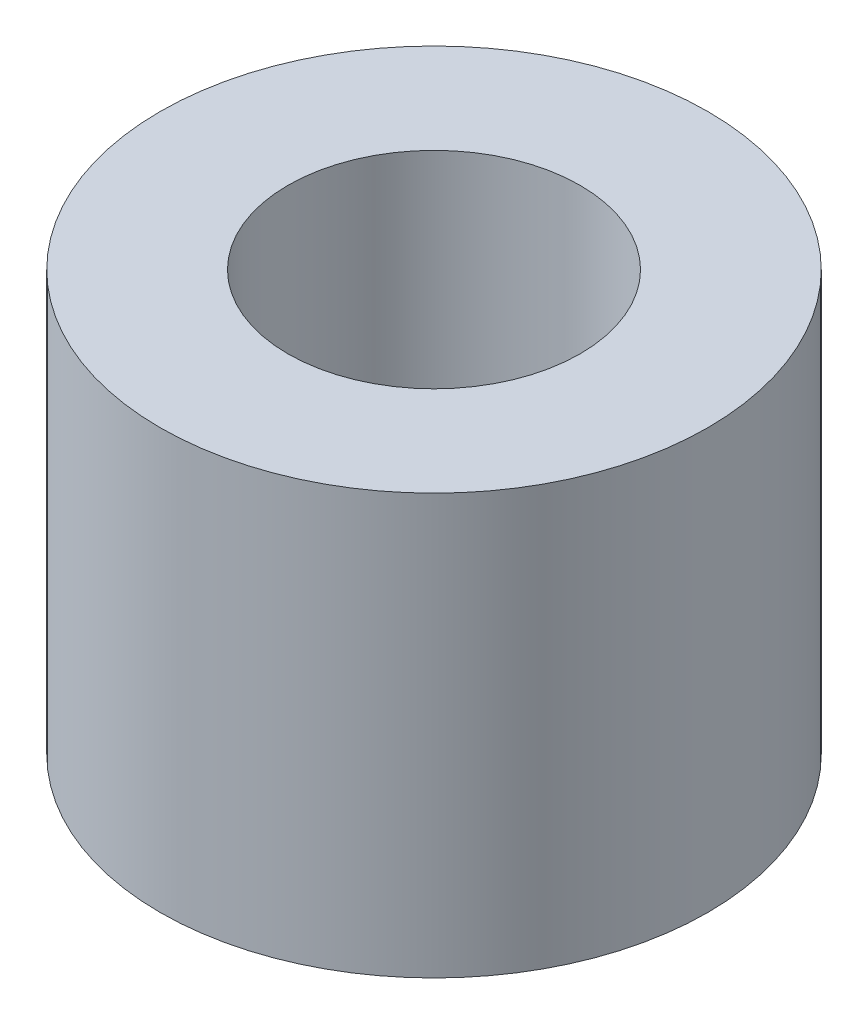
ISO-10303-21;
HEADER;
FILE_DESCRIPTION(('STEP AP214'),'2;1');
FILE_NAME('part.step','',(''),(''),'','','');
FILE_SCHEMA(('AUTOMOTIVE_DESIGN { 1 0 10303 214 1 1 1 1 }'));
ENDSEC;
DATA;
#1=APPLICATION_CONTEXT('core data for automotive mechanical design processes');
#2=APPLICATION_PROTOCOL_DEFINITION('international standard','automotive_design',2000,#1);
#3=PRODUCT_CONTEXT('',#1,'mechanical');
#4=PRODUCT('Part','Part','',(#3));
#5=PRODUCT_RELATED_PRODUCT_CATEGORY('part','',(#4));
#6=PRODUCT_DEFINITION_FORMATION('','',#4);
#7=PRODUCT_DEFINITION_CONTEXT('part definition',#1,'design');
#8=PRODUCT_DEFINITION('design','',#6,#7);
#9=PRODUCT_DEFINITION_SHAPE('','',#8);
#10=(LENGTH_UNIT() NAMED_UNIT(*) SI_UNIT(.MILLI.,.METRE.));
#11=(NAMED_UNIT(*) PLANE_ANGLE_UNIT() SI_UNIT($,.RADIAN.));
#12=(NAMED_UNIT(*) SI_UNIT($,.STERADIAN.) SOLID_ANGLE_UNIT());
#13=UNCERTAINTY_MEASURE_WITH_UNIT(LENGTH_MEASURE(1.E-05),#10,'distance_accuracy_value','');
#14=(GEOMETRIC_REPRESENTATION_CONTEXT(3) GLOBAL_UNCERTAINTY_ASSIGNED_CONTEXT((#13)) GLOBAL_UNIT_ASSIGNED_CONTEXT((#10,
#11,#12)) REPRESENTATION_CONTEXT('',''));
#15=CARTESIAN_POINT('',(0.,0.,0.));
#16=DIRECTION('',(0.,0.,1.));
#17=DIRECTION('',(1.,0.,0.));
#18=AXIS2_PLACEMENT_3D('',#15,#16,#17);
#19=CARTESIAN_POINT('',(-5.07538834601945,5.1,-2.78377360796824));
#20=DIRECTION('',(0.,-1.,0.));
#21=DIRECTION('',(0.,0.,-1.));
#22=AXIS2_PLACEMENT_3D('',#19,#20,#21);
#23=CYLINDRICAL_SURFACE('',#22,3.);
#24=CARTESIAN_POINT('',(-5.07538834601945,0.,-2.78377360796824));
#25=DIRECTION('',(0.,1.,0.));
#26=DIRECTION('',(0.,0.,1.));
#27=AXIS2_PLACEMENT_3D('',#24,#25,#26);
#28=CIRCLE('',#27,3.);
#29=CARTESIAN_POINT('',(-5.07538834601945,0.,0.21622639203176));
#30=VERTEX_POINT('',#29);
#31=EDGE_CURVE('E10',#30,#30,#28,.T.);
#32=ORIENTED_EDGE('',*,*,#31,.T.);
#33=EDGE_LOOP('',(#32));
#34=FACE_BOUND('',#33,.T.);
#35=CARTESIAN_POINT('',(-5.07538834601945,4.6,-2.78377360796824));
#36=DIRECTION('',(0.,1.,0.));
#37=DIRECTION('',(0.,0.,1.));
#38=AXIS2_PLACEMENT_3D('',#35,#36,#37);
#39=CIRCLE('',#38,3.);
#40=CARTESIAN_POINT('',(-5.07538834601945,4.6,0.21622639203176));
#41=VERTEX_POINT('',#40);
#42=EDGE_CURVE('E27',#41,#41,#39,.T.);
#43=ORIENTED_EDGE('',*,*,#42,.F.);
#44=EDGE_LOOP('',(#43));
#45=FACE_BOUND('',#44,.T.);
#46=ADVANCED_FACE('F14',(#34,#45),#23,.T.);
#47=CARTESIAN_POINT('',(-5.07538834601945,0.,-2.78377360796824));
#48=DIRECTION('',(0.,1.,0.));
#49=DIRECTION('',(0.,0.,1.));
#50=AXIS2_PLACEMENT_3D('',#47,#48,#49);
#51=CYLINDRICAL_SURFACE('',#50,1.6);
#52=CARTESIAN_POINT('',(-5.07538834601945,0.,-2.78377360796824));
#53=DIRECTION('',(0.,1.,0.));
#54=DIRECTION('',(0.,0.,1.));
#55=AXIS2_PLACEMENT_3D('',#52,#53,#54);
#56=CIRCLE('',#55,1.6);
#57=CARTESIAN_POINT('',(-5.07538834601945,0.,-1.18377360796824));
#58=VERTEX_POINT('',#57);
#59=EDGE_CURVE('E21',#58,#58,#56,.T.);
#60=ORIENTED_EDGE('',*,*,#59,.F.);
#61=EDGE_LOOP('',(#60));
#62=FACE_BOUND('',#61,.T.);
#63=CARTESIAN_POINT('',(-5.07538834601945,4.6,-2.78377360796824));
#64=DIRECTION('',(0.,1.,0.));
#65=DIRECTION('',(0.,0.,1.));
#66=AXIS2_PLACEMENT_3D('',#63,#64,#65);
#67=CIRCLE('',#66,1.6);
#68=CARTESIAN_POINT('',(-5.07538834601945,4.6,-1.18377360796824));
#69=VERTEX_POINT('',#68);
#70=EDGE_CURVE('E17',#69,#69,#67,.F.);
#71=ORIENTED_EDGE('',*,*,#70,.F.);
#72=EDGE_LOOP('',(#71));
#73=FACE_BOUND('',#72,.T.);
#74=ADVANCED_FACE('F36',(#62,#73),#51,.F.);
#75=CARTESIAN_POINT('',(-5.07538834601945,0.,-2.78377360796824));
#76=DIRECTION('',(0.,1.,0.));
#77=DIRECTION('',(0.,0.,1.));
#78=AXIS2_PLACEMENT_3D('',#75,#76,#77);
#79=PLANE('',#78);
#80=ORIENTED_EDGE('',*,*,#59,.T.);
#81=EDGE_LOOP('',(#80));
#82=FACE_BOUND('',#81,.T.);
#83=ORIENTED_EDGE('',*,*,#31,.F.);
#84=EDGE_LOOP('',(#83));
#85=FACE_BOUND('',#84,.T.);
#86=ADVANCED_FACE('F38',(#82,#85),#79,.F.);
#87=CARTESIAN_POINT('',(-5.07538834601945,4.6,-2.78377360796824));
#88=DIRECTION('',(0.,1.,0.));
#89=DIRECTION('',(0.,0.,1.));
#90=AXIS2_PLACEMENT_3D('',#87,#88,#89);
#91=PLANE('',#90);
#92=ORIENTED_EDGE('',*,*,#42,.T.);
#93=EDGE_LOOP('',(#92));
#94=FACE_BOUND('',#93,.T.);
#95=ORIENTED_EDGE('',*,*,#70,.T.);
#96=EDGE_LOOP('',(#95));
#97=FACE_BOUND('',#96,.T.);
#98=ADVANCED_FACE('F34',(#94,#97),#91,.T.);
#99=CLOSED_SHELL('',(#46,#74,#86,#98));
#100=MANIFOLD_SOLID_BREP('B1',#99);
#101=ADVANCED_BREP_SHAPE_REPRESENTATION('',(#18,#100),#14);
#102=SHAPE_DEFINITION_REPRESENTATION(#9,#101);
ENDSEC;
END-ISO-10303-21;
